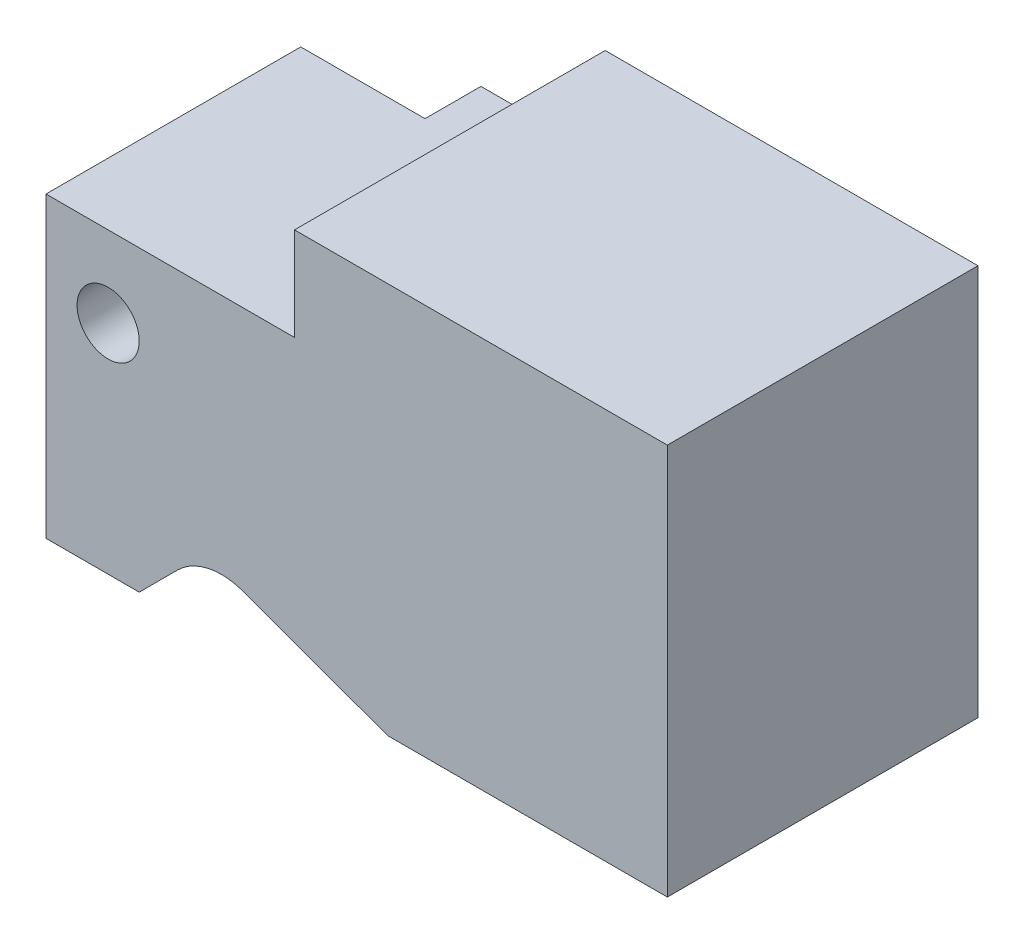
ISO-10303-21;
HEADER;
FILE_DESCRIPTION(('STEP AP214'),'2;1');
FILE_NAME('part.step','',(''),(''),'','','');
FILE_SCHEMA(('AUTOMOTIVE_DESIGN { 1 0 10303 214 1 1 1 1 }'));
ENDSEC;
DATA;
#1=APPLICATION_CONTEXT('core data for automotive mechanical design processes');
#2=APPLICATION_PROTOCOL_DEFINITION('international standard','automotive_design',2000,#1);
#3=PRODUCT_CONTEXT('',#1,'mechanical');
#4=PRODUCT('Part','Part','',(#3));
#5=PRODUCT_RELATED_PRODUCT_CATEGORY('part','',(#4));
#6=PRODUCT_DEFINITION_FORMATION('','',#4);
#7=PRODUCT_DEFINITION_CONTEXT('part definition',#1,'design');
#8=PRODUCT_DEFINITION('design','',#6,#7);
#9=PRODUCT_DEFINITION_SHAPE('','',#8);
#10=(LENGTH_UNIT() NAMED_UNIT(*) SI_UNIT(.MILLI.,.METRE.));
#11=(NAMED_UNIT(*) PLANE_ANGLE_UNIT() SI_UNIT($,.RADIAN.));
#12=(NAMED_UNIT(*) SI_UNIT($,.STERADIAN.) SOLID_ANGLE_UNIT());
#13=UNCERTAINTY_MEASURE_WITH_UNIT(LENGTH_MEASURE(1.E-05),#10,'distance_accuracy_value','');
#14=(GEOMETRIC_REPRESENTATION_CONTEXT(3) GLOBAL_UNCERTAINTY_ASSIGNED_CONTEXT((#13)) GLOBAL_UNIT_ASSIGNED_CONTEXT((#10,
#11,#12)) REPRESENTATION_CONTEXT('',''));
#15=CARTESIAN_POINT('',(0.,0.,0.));
#16=DIRECTION('',(0.,0.,1.));
#17=DIRECTION('',(1.,0.,0.));
#18=AXIS2_PLACEMENT_3D('',#15,#16,#17);
#19=CARTESIAN_POINT('',(70.,35.,-5.));
#20=DIRECTION('',(0.,0.,1.));
#21=DIRECTION('',(1.,0.,0.));
#22=AXIS2_PLACEMENT_3D('',#19,#20,#21);
#23=CYLINDRICAL_SURFACE('',#22,10.);
#24=CARTESIAN_POINT('',(70.,35.,0.));
#25=DIRECTION('',(0.,0.,-1.));
#26=DIRECTION('',(-1.,0.,0.));
#27=AXIS2_PLACEMENT_3D('',#24,#25,#26);
#28=CIRCLE('',#27,10.);
#29=CARTESIAN_POINT('',(70.,45.,0.));
#30=VERTEX_POINT('',#29);
#31=CARTESIAN_POINT('',(70.,25.,0.));
#32=VERTEX_POINT('',#31);
#33=EDGE_CURVE('E86',#30,#32,#28,.F.);
#34=ORIENTED_EDGE('',*,*,#33,.F.);
#35=DIRECTION('',(0.,0.,1.));
#36=VECTOR('',#35,1.);
#37=CARTESIAN_POINT('',(70.,45.,-5.));
#38=LINE('',#37,#36);
#39=CARTESIAN_POINT('',(70.,45.,-5.));
#40=VERTEX_POINT('',#39);
#41=EDGE_CURVE('E12',#40,#30,#38,.T.);
#42=ORIENTED_EDGE('',*,*,#41,.F.);
#43=CARTESIAN_POINT('',(70.,35.,-5.));
#44=DIRECTION('',(0.,0.,-1.));
#45=DIRECTION('',(-1.,0.,0.));
#46=AXIS2_PLACEMENT_3D('',#43,#44,#45);
#47=CIRCLE('',#46,10.);
#48=CARTESIAN_POINT('',(70.,25.,-5.));
#49=VERTEX_POINT('',#48);
#50=EDGE_CURVE('E87',#40,#49,#47,.F.);
#51=ORIENTED_EDGE('',*,*,#50,.T.);
#52=DIRECTION('',(0.,0.,1.));
#53=VECTOR('',#52,1.);
#54=CARTESIAN_POINT('',(70.,25.,-5.));
#55=LINE('',#54,#53);
#56=EDGE_CURVE('E83',#49,#32,#55,.T.);
#57=ORIENTED_EDGE('',*,*,#56,.T.);
#58=EDGE_LOOP('',(#34,#42,#51,#57));
#59=FACE_BOUND('',#58,.T.);
#60=ADVANCED_FACE('F47',(#59),#23,.T.);
#61=CARTESIAN_POINT('',(70.,0.,-5.));
#62=DIRECTION('',(-1.,0.,0.));
#63=DIRECTION('',(0.,0.,1.));
#64=AXIS2_PLACEMENT_3D('',#61,#62,#63);
#65=PLANE('',#64);
#66=DIRECTION('',(0.,-1.,0.));
#67=VECTOR('',#66,1.);
#68=CARTESIAN_POINT('',(70.,0.,0.));
#69=LINE('',#68,#67);
#70=CARTESIAN_POINT('',(70.,40.,0.));
#71=VERTEX_POINT('',#70);
#72=EDGE_CURVE('E96',#30,#71,#69,.T.);
#73=ORIENTED_EDGE('',*,*,#72,.T.);
#74=DIRECTION('',(0.,0.,1.));
#75=VECTOR('',#74,1.);
#76=CARTESIAN_POINT('',(70.,40.,-5.));
#77=LINE('',#76,#75);
#78=CARTESIAN_POINT('',(70.,40.,-5.));
#79=VERTEX_POINT('',#78);
#80=EDGE_CURVE('E55',#79,#71,#77,.T.);
#81=ORIENTED_EDGE('',*,*,#80,.F.);
#82=DIRECTION('',(0.,-1.,0.));
#83=VECTOR('',#82,1.);
#84=CARTESIAN_POINT('',(70.,0.,-5.));
#85=LINE('',#84,#83);
#86=EDGE_CURVE('E118',#40,#79,#85,.T.);
#87=ORIENTED_EDGE('',*,*,#86,.F.);
#88=ORIENTED_EDGE('',*,*,#41,.T.);
#89=EDGE_LOOP('',(#73,#81,#87,#88));
#90=FACE_BOUND('',#89,.T.);
#91=ADVANCED_FACE('F117',(#90),#65,.F.);
#92=CARTESIAN_POINT('',(70.,0.,-5.));
#93=DIRECTION('',(-1.,0.,0.));
#94=DIRECTION('',(0.,0.,1.));
#95=AXIS2_PLACEMENT_3D('',#92,#93,#94);
#96=PLANE('',#95);
#97=DIRECTION('',(0.,-1.,0.));
#98=VECTOR('',#97,1.);
#99=CARTESIAN_POINT('',(70.,0.,0.));
#100=LINE('',#99,#98);
#101=CARTESIAN_POINT('',(70.,30.,0.));
#102=VERTEX_POINT('',#101);
#103=EDGE_CURVE('E92',#102,#32,#100,.T.);
#104=ORIENTED_EDGE('',*,*,#103,.T.);
#105=ORIENTED_EDGE('',*,*,#56,.F.);
#106=DIRECTION('',(0.,-1.,0.));
#107=VECTOR('',#106,1.);
#108=CARTESIAN_POINT('',(70.,0.,-5.));
#109=LINE('',#108,#107);
#110=CARTESIAN_POINT('',(70.,30.,-5.));
#111=VERTEX_POINT('',#110);
#112=EDGE_CURVE('E63',#111,#49,#109,.T.);
#113=ORIENTED_EDGE('',*,*,#112,.F.);
#114=DIRECTION('',(0.,0.,1.));
#115=VECTOR('',#114,1.);
#116=CARTESIAN_POINT('',(70.,30.,-5.));
#117=LINE('',#116,#115);
#118=EDGE_CURVE('E89',#111,#102,#117,.T.);
#119=ORIENTED_EDGE('',*,*,#118,.T.);
#120=EDGE_LOOP('',(#104,#105,#113,#119));
#121=FACE_BOUND('',#120,.T.);
#122=ADVANCED_FACE('F93',(#121),#96,.F.);
#123=CARTESIAN_POINT('',(0.,0.,-5.));
#124=DIRECTION('',(0.,0.,-1.));
#125=DIRECTION('',(-1.,0.,0.));
#126=AXIS2_PLACEMENT_3D('',#123,#124,#125);
#127=PLANE('',#126);
#128=ORIENTED_EDGE('',*,*,#50,.F.);
#129=ORIENTED_EDGE('',*,*,#86,.T.);
#130=CARTESIAN_POINT('',(70.,35.,-5.));
#131=DIRECTION('',(0.,0.,-1.));
#132=DIRECTION('',(-1.,0.,0.));
#133=AXIS2_PLACEMENT_3D('',#130,#131,#132);
#134=CIRCLE('',#133,5.00000000000001);
#135=EDGE_CURVE('E113',#111,#79,#134,.T.);
#136=ORIENTED_EDGE('',*,*,#135,.F.);
#137=ORIENTED_EDGE('',*,*,#112,.T.);
#138=EDGE_LOOP('',(#128,#129,#136,#137));
#139=FACE_BOUND('',#138,.T.);
#140=ADVANCED_FACE('F120',(#139),#127,.T.);
#141=CARTESIAN_POINT('',(0.,0.,0.));
#142=DIRECTION('',(0.,0.,-1.));
#143=DIRECTION('',(-1.,0.,0.));
#144=AXIS2_PLACEMENT_3D('',#141,#142,#143);
#145=PLANE('',#144);
#146=ORIENTED_EDGE('',*,*,#33,.T.);
#147=ORIENTED_EDGE('',*,*,#103,.F.);
#148=CARTESIAN_POINT('',(70.,35.,0.));
#149=DIRECTION('',(0.,0.,-1.));
#150=DIRECTION('',(-1.,0.,0.));
#151=AXIS2_PLACEMENT_3D('',#148,#149,#150);
#152=CIRCLE('',#151,5.00000000000001);
#153=EDGE_CURVE('E77',#71,#102,#152,.T.);
#154=ORIENTED_EDGE('',*,*,#153,.F.);
#155=ORIENTED_EDGE('',*,*,#72,.F.);
#156=EDGE_LOOP('',(#146,#147,#154,#155));
#157=FACE_BOUND('',#156,.T.);
#158=ADVANCED_FACE('F98',(#157),#145,.F.);
#159=CARTESIAN_POINT('',(70.,35.,-8.));
#160=DIRECTION('',(0.,0.,1.));
#161=DIRECTION('',(1.,0.,0.));
#162=AXIS2_PLACEMENT_3D('',#159,#160,#161);
#163=CYLINDRICAL_SURFACE('',#162,5.00000000000001);
#164=CARTESIAN_POINT('',(70.,35.,-8.));
#165=DIRECTION('',(0.,0.,-1.));
#166=DIRECTION('',(-1.,0.,0.));
#167=AXIS2_PLACEMENT_3D('',#164,#165,#166);
#168=CIRCLE('',#167,5.00000000000001);
#169=CARTESIAN_POINT('',(65.,35.,-8.));
#170=VERTEX_POINT('',#169);
#171=EDGE_CURVE('E100',#170,#170,#168,.T.);
#172=ORIENTED_EDGE('',*,*,#171,.F.);
#173=EDGE_LOOP('',(#172));
#174=FACE_BOUND('',#173,.T.);
#175=ORIENTED_EDGE('',*,*,#135,.T.);
#176=ORIENTED_EDGE('',*,*,#80,.T.);
#177=ORIENTED_EDGE('',*,*,#153,.T.);
#178=ORIENTED_EDGE('',*,*,#118,.F.);
#179=EDGE_LOOP('',(#175,#176,#177,#178));
#180=FACE_BOUND('',#179,.T.);
#181=ADVANCED_FACE('F111',(#174,#180),#163,.T.);
#182=CARTESIAN_POINT('',(0.,0.,-8.));
#183=DIRECTION('',(0.,0.,-1.));
#184=DIRECTION('',(-1.,0.,0.));
#185=AXIS2_PLACEMENT_3D('',#182,#183,#184);
#186=PLANE('',#185);
#187=ORIENTED_EDGE('',*,*,#171,.T.);
#188=EDGE_LOOP('',(#187));
#189=FACE_BOUND('',#188,.T.);
#190=ADVANCED_FACE('F162',(#189),#186,.T.);
#191=CLOSED_SHELL('',(#60,#91,#122,#140,#158,#181,#190));
#192=MANIFOLD_SOLID_BREP('B2',#191);
#193=CARTESIAN_POINT('',(0.,0.,50.));
#194=DIRECTION('',(0.,1.,0.));
#195=DIRECTION('',(0.,0.,1.));
#196=AXIS2_PLACEMENT_3D('',#193,#194,#195);
#197=PLANE('',#196);
#198=DIRECTION('',(1.,0.,0.));
#199=VECTOR('',#198,1.);
#200=CARTESIAN_POINT('',(0.,0.,50.));
#201=LINE('',#200,#199);
#202=CARTESIAN_POINT('',(55.,0.,50.));
#203=VERTEX_POINT('',#202);
#204=CARTESIAN_POINT('',(100.,0.,50.));
#205=VERTEX_POINT('',#204);
#206=EDGE_CURVE('E311',#203,#205,#201,.T.);
#207=ORIENTED_EDGE('',*,*,#206,.F.);
#208=DIRECTION('',(0.,0.,-1.));
#209=VECTOR('',#208,1.);
#210=CARTESIAN_POINT('',(55.,0.,50.));
#211=LINE('',#210,#209);
#212=CARTESIAN_POINT('',(55.,0.,0.));
#213=VERTEX_POINT('',#212);
#214=EDGE_CURVE('E361',#203,#213,#211,.T.);
#215=ORIENTED_EDGE('',*,*,#214,.T.);
#216=DIRECTION('',(1.,0.,0.));
#217=VECTOR('',#216,1.);
#218=CARTESIAN_POINT('',(0.,0.,0.));
#219=LINE('',#218,#217);
#220=CARTESIAN_POINT('',(100.,0.,0.));
#221=VERTEX_POINT('',#220);
#222=EDGE_CURVE('E323',#213,#221,#219,.T.);
#223=ORIENTED_EDGE('',*,*,#222,.T.);
#224=DIRECTION('',(0.,0.,-1.));
#225=VECTOR('',#224,1.);
#226=CARTESIAN_POINT('',(100.,0.,50.));
#227=LINE('',#226,#225);
#228=EDGE_CURVE('E197',#205,#221,#227,.T.);
#229=ORIENTED_EDGE('',*,*,#228,.F.);
#230=EDGE_LOOP('',(#207,#215,#223,#229));
#231=FACE_BOUND('',#230,.T.);
#232=ADVANCED_FACE('F188',(#231),#197,.F.);
#233=CARTESIAN_POINT('',(0.,0.,50.));
#234=DIRECTION('',(1.,0.,0.));
#235=DIRECTION('',(0.,0.,-1.));
#236=AXIS2_PLACEMENT_3D('',#233,#234,#235);
#237=PLANE('',#236);
#238=DIRECTION('',(0.,0.,-1.));
#239=VECTOR('',#238,1.);
#240=CARTESIAN_POINT('',(0.,15.,9.));
#241=LINE('',#240,#239);
#242=CARTESIAN_POINT('',(0.,15.,9.));
#243=VERTEX_POINT('',#242);
#244=CARTESIAN_POINT('',(0.,15.,0.));
#245=VERTEX_POINT('',#244);
#246=EDGE_CURVE('E382',#243,#245,#241,.T.);
#247=ORIENTED_EDGE('',*,*,#246,.T.);
#248=DIRECTION('',(0.,-1.,0.));
#249=VECTOR('',#248,1.);
#250=CARTESIAN_POINT('',(0.,0.,0.));
#251=LINE('',#250,#249);
#252=CARTESIAN_POINT('',(0.,0.,0.));
#253=VERTEX_POINT('',#252);
#254=EDGE_CURVE('E321',#245,#253,#251,.T.);
#255=ORIENTED_EDGE('',*,*,#254,.T.);
#256=DIRECTION('',(0.,0.,-1.));
#257=VECTOR('',#256,1.);
#258=CARTESIAN_POINT('',(0.,0.,50.));
#259=LINE('',#258,#257);
#260=CARTESIAN_POINT('',(0.,0.,50.));
#261=VERTEX_POINT('',#260);
#262=EDGE_CURVE('E45',#261,#253,#259,.T.);
#263=ORIENTED_EDGE('',*,*,#262,.F.);
#264=DIRECTION('',(0.,-1.,0.));
#265=VECTOR('',#264,1.);
#266=CARTESIAN_POINT('',(0.,0.,50.));
#267=LINE('',#266,#265);
#268=CARTESIAN_POINT('',(0.,48.,50.));
#269=VERTEX_POINT('',#268);
#270=EDGE_CURVE('E309',#269,#261,#267,.T.);
#271=ORIENTED_EDGE('',*,*,#270,.F.);
#272=DIRECTION('',(0.,0.,-1.));
#273=VECTOR('',#272,1.);
#274=CARTESIAN_POINT('',(0.,48.,50.));
#275=LINE('',#274,#273);
#276=CARTESIAN_POINT('',(0.,48.,9.));
#277=VERTEX_POINT('',#276);
#278=EDGE_CURVE('E324',#269,#277,#275,.T.);
#279=ORIENTED_EDGE('',*,*,#278,.T.);
#280=DIRECTION('',(0.,1.,0.));
#281=VECTOR('',#280,1.);
#282=CARTESIAN_POINT('',(0.,0.,9.));
#283=LINE('',#282,#281);
#284=EDGE_CURVE('E212',#243,#277,#283,.T.);
#285=ORIENTED_EDGE('',*,*,#284,.F.);
#286=EDGE_LOOP('',(#247,#255,#263,#271,#279,#285));
#287=FACE_BOUND('',#286,.T.);
#288=ADVANCED_FACE('F190',(#287),#237,.F.);
#289=CARTESIAN_POINT('',(0.,0.,0.));
#290=DIRECTION('',(0.,0.,-1.));
#291=DIRECTION('',(-1.,0.,0.));
#292=AXIS2_PLACEMENT_3D('',#289,#290,#291);
#293=PLANE('',#292);
#294=CARTESIAN_POINT('',(70.,35.,0.));
#295=DIRECTION('',(0.,0.,-1.));
#296=DIRECTION('',(-1.,0.,0.));
#297=AXIS2_PLACEMENT_3D('',#294,#295,#296);
#298=CIRCLE('',#297,25.);
#299=CARTESIAN_POINT('',(45.,35.,0.));
#300=VERTEX_POINT('',#299);
#301=EDGE_CURVE('E420',#300,#300,#298,.T.);
#302=ORIENTED_EDGE('',*,*,#301,.F.);
#303=EDGE_LOOP('',(#302));
#304=FACE_BOUND('',#303,.T.);
#305=DIRECTION('',(0.939692620785908,-0.342020143325669,0.));
#306=VECTOR('',#305,1.);
#307=CARTESIAN_POINT('',(31.6603490669296,8.49493821780105,0.));
#308=LINE('',#307,#306);
#309=CARTESIAN_POINT('',(31.6603490669296,8.49493821780104,0.));
#310=VERTEX_POINT('',#309);
#311=EDGE_CURVE('E294',#310,#213,#308,.T.);
#312=ORIENTED_EDGE('',*,*,#311,.F.);
#313=CARTESIAN_POINT('',(28.2401476336729,-0.901987990058035,0.));
#314=DIRECTION('',(0.,0.,-1.));
#315=DIRECTION('',(-1.,0.,0.));
#316=AXIS2_PLACEMENT_3D('',#313,#314,#315);
#317=CIRCLE('',#316,10.);
#318=CARTESIAN_POINT('',(21.1690798218074,6.16907982180743,0.));
#319=VERTEX_POINT('',#318);
#320=EDGE_CURVE('E416',#319,#310,#317,.T.);
#321=ORIENTED_EDGE('',*,*,#320,.F.);
#322=DIRECTION('',(0.707106781186547,0.707106781186548,0.));
#323=VECTOR('',#322,1.);
#324=CARTESIAN_POINT('',(15.,0.,0.));
#325=LINE('',#324,#323);
#326=CARTESIAN_POINT('',(15.,0.,0.));
#327=VERTEX_POINT('',#326);
#328=EDGE_CURVE('E414',#327,#319,#325,.T.);
#329=ORIENTED_EDGE('',*,*,#328,.F.);
#330=EDGE_CURVE('E303',#253,#327,#219,.T.);
#331=ORIENTED_EDGE('',*,*,#330,.F.);
#332=ORIENTED_EDGE('',*,*,#254,.F.);
#333=CARTESIAN_POINT('',(0.,35.,0.));
#334=DIRECTION('',(0.,0.,-1.));
#335=DIRECTION('',(-1.,0.,0.));
#336=AXIS2_PLACEMENT_3D('',#333,#334,#335);
#337=CIRCLE('',#336,20.);
#338=CARTESIAN_POINT('',(20.,35.,0.));
#339=VERTEX_POINT('',#338);
#340=EDGE_CURVE('E383',#245,#339,#337,.F.);
#341=ORIENTED_EDGE('',*,*,#340,.T.);
#342=DIRECTION('',(0.,1.,0.));
#343=VECTOR('',#342,1.);
#344=CARTESIAN_POINT('',(20.,0.,0.));
#345=LINE('',#344,#343);
#346=CARTESIAN_POINT('',(20.,48.,0.));
#347=VERTEX_POINT('',#346);
#348=EDGE_CURVE('E376',#339,#347,#345,.T.);
#349=ORIENTED_EDGE('',*,*,#348,.T.);
#350=DIRECTION('',(-1.,0.,0.));
#351=VECTOR('',#350,1.);
#352=CARTESIAN_POINT('',(40.,48.,0.));
#353=LINE('',#352,#351);
#354=CARTESIAN_POINT('',(40.,48.,0.));
#355=VERTEX_POINT('',#354);
#356=EDGE_CURVE('E397',#355,#347,#353,.T.);
#357=ORIENTED_EDGE('',*,*,#356,.F.);
#358=DIRECTION('',(0.,-1.,0.));
#359=VECTOR('',#358,1.);
#360=CARTESIAN_POINT('',(40.,63.,0.));
#361=LINE('',#360,#359);
#362=CARTESIAN_POINT('',(40.,63.,0.));
#363=VERTEX_POINT('',#362);
#364=EDGE_CURVE('E350',#363,#355,#361,.T.);
#365=ORIENTED_EDGE('',*,*,#364,.F.);
#366=DIRECTION('',(-1.,0.,0.));
#367=VECTOR('',#366,1.);
#368=CARTESIAN_POINT('',(0.,63.,0.));
#369=LINE('',#368,#367);
#370=CARTESIAN_POINT('',(100.,63.,0.));
#371=VERTEX_POINT('',#370);
#372=EDGE_CURVE('E328',#371,#363,#369,.T.);
#373=ORIENTED_EDGE('',*,*,#372,.F.);
#374=DIRECTION('',(0.,1.,0.));
#375=VECTOR('',#374,1.);
#376=CARTESIAN_POINT('',(100.,0.,0.));
#377=LINE('',#376,#375);
#378=EDGE_CURVE('E326',#221,#371,#377,.T.);
#379=ORIENTED_EDGE('',*,*,#378,.F.);
#380=ORIENTED_EDGE('',*,*,#222,.F.);
#381=EDGE_LOOP('',(#312,#321,#329,#331,#332,#341,#349,#357,#365,#373,#379,#380));
#382=FACE_BOUND('',#381,.T.);
#383=ADVANCED_FACE('F346',(#304,#382),#293,.T.);
#384=CARTESIAN_POINT('',(40.,48.,50.));
#385=DIRECTION('',(0.,-1.,0.));
#386=DIRECTION('',(0.,0.,-1.));
#387=AXIS2_PLACEMENT_3D('',#384,#385,#386);
#388=PLANE('',#387);
#389=DIRECTION('',(0.,0.,-1.));
#390=VECTOR('',#389,1.);
#391=CARTESIAN_POINT('',(20.,48.,9.));
#392=LINE('',#391,#390);
#393=CARTESIAN_POINT('',(20.,48.,9.));
#394=VERTEX_POINT('',#393);
#395=EDGE_CURVE('E391',#394,#347,#392,.T.);
#396=ORIENTED_EDGE('',*,*,#395,.F.);
#397=DIRECTION('',(1.,0.,0.));
#398=VECTOR('',#397,1.);
#399=CARTESIAN_POINT('',(0.,48.,9.));
#400=LINE('',#399,#398);
#401=EDGE_CURVE('E378',#277,#394,#400,.T.);
#402=ORIENTED_EDGE('',*,*,#401,.F.);
#403=ORIENTED_EDGE('',*,*,#278,.F.);
#404=DIRECTION('',(-1.,0.,0.));
#405=VECTOR('',#404,1.);
#406=CARTESIAN_POINT('',(40.,48.,50.));
#407=LINE('',#406,#405);
#408=CARTESIAN_POINT('',(40.,48.,50.));
#409=VERTEX_POINT('',#408);
#410=EDGE_CURVE('E396',#409,#269,#407,.T.);
#411=ORIENTED_EDGE('',*,*,#410,.F.);
#412=DIRECTION('',(0.,0.,-1.));
#413=VECTOR('',#412,1.);
#414=CARTESIAN_POINT('',(40.,48.,50.));
#415=LINE('',#414,#413);
#416=EDGE_CURVE('E404',#409,#355,#415,.T.);
#417=ORIENTED_EDGE('',*,*,#416,.T.);
#418=ORIENTED_EDGE('',*,*,#356,.T.);
#419=EDGE_LOOP('',(#396,#402,#403,#411,#417,#418));
#420=FACE_BOUND('',#419,.T.);
#421=ADVANCED_FACE('F410',(#420),#388,.F.);
#422=ORIENTED_EDGE('',*,*,#330,.T.);
#423=DIRECTION('',(0.,0.,-1.));
#424=VECTOR('',#423,1.);
#425=CARTESIAN_POINT('',(15.,0.,50.));
#426=LINE('',#425,#424);
#427=CARTESIAN_POINT('',(15.,0.,50.));
#428=VERTEX_POINT('',#427);
#429=EDGE_CURVE('E289',#428,#327,#426,.T.);
#430=ORIENTED_EDGE('',*,*,#429,.F.);
#431=EDGE_CURVE('E300',#261,#428,#201,.T.);
#432=ORIENTED_EDGE('',*,*,#431,.F.);
#433=ORIENTED_EDGE('',*,*,#262,.T.);
#434=EDGE_LOOP('',(#422,#430,#432,#433));
#435=FACE_BOUND('',#434,.T.);
#436=ADVANCED_FACE('F299',(#435),#197,.F.);
#437=CARTESIAN_POINT('',(100.,0.,50.));
#438=DIRECTION('',(-1.,0.,0.));
#439=DIRECTION('',(0.,0.,1.));
#440=AXIS2_PLACEMENT_3D('',#437,#438,#439);
#441=PLANE('',#440);
#442=ORIENTED_EDGE('',*,*,#378,.T.);
#443=DIRECTION('',(0.,0.,-1.));
#444=VECTOR('',#443,1.);
#445=CARTESIAN_POINT('',(100.,63.,50.));
#446=LINE('',#445,#444);
#447=CARTESIAN_POINT('',(100.,63.,50.));
#448=VERTEX_POINT('',#447);
#449=EDGE_CURVE('E320',#448,#371,#446,.T.);
#450=ORIENTED_EDGE('',*,*,#449,.F.);
#451=DIRECTION('',(0.,1.,0.));
#452=VECTOR('',#451,1.);
#453=CARTESIAN_POINT('',(100.,0.,50.));
#454=LINE('',#453,#452);
#455=EDGE_CURVE('E310',#205,#448,#454,.T.);
#456=ORIENTED_EDGE('',*,*,#455,.F.);
#457=ORIENTED_EDGE('',*,*,#228,.T.);
#458=EDGE_LOOP('',(#442,#450,#456,#457));
#459=FACE_BOUND('',#458,.T.);
#460=ADVANCED_FACE('F338',(#459),#441,.F.);
#461=CARTESIAN_POINT('',(0.,63.,50.));
#462=DIRECTION('',(0.,-1.,0.));
#463=DIRECTION('',(0.,0.,-1.));
#464=AXIS2_PLACEMENT_3D('',#461,#462,#463);
#465=PLANE('',#464);
#466=ORIENTED_EDGE('',*,*,#372,.T.);
#467=DIRECTION('',(0.,0.,-1.));
#468=VECTOR('',#467,1.);
#469=CARTESIAN_POINT('',(40.,63.,50.));
#470=LINE('',#469,#468);
#471=CARTESIAN_POINT('',(40.,63.,50.));
#472=VERTEX_POINT('',#471);
#473=EDGE_CURVE('E355',#472,#363,#470,.T.);
#474=ORIENTED_EDGE('',*,*,#473,.F.);
#475=DIRECTION('',(-1.,0.,0.));
#476=VECTOR('',#475,1.);
#477=CARTESIAN_POINT('',(0.,63.,50.));
#478=LINE('',#477,#476);
#479=EDGE_CURVE('E313',#448,#472,#478,.T.);
#480=ORIENTED_EDGE('',*,*,#479,.F.);
#481=ORIENTED_EDGE('',*,*,#449,.T.);
#482=EDGE_LOOP('',(#466,#474,#480,#481));
#483=FACE_BOUND('',#482,.T.);
#484=ADVANCED_FACE('F353',(#483),#465,.F.);
#485=CARTESIAN_POINT('',(0.,0.,50.));
#486=DIRECTION('',(0.,0.,-1.));
#487=DIRECTION('',(-1.,0.,0.));
#488=AXIS2_PLACEMENT_3D('',#485,#486,#487);
#489=PLANE('',#488);
#490=CARTESIAN_POINT('',(10.,35.,50.));
#491=DIRECTION('',(0.,0.,-1.));
#492=DIRECTION('',(-1.,0.,0.));
#493=AXIS2_PLACEMENT_3D('',#490,#491,#492);
#494=CIRCLE('',#493,5.);
#495=CARTESIAN_POINT('',(5.,35.,50.));
#496=VERTEX_POINT('',#495);
#497=EDGE_CURVE('E363',#496,#496,#494,.T.);
#498=ORIENTED_EDGE('',*,*,#497,.T.);
#499=EDGE_LOOP('',(#498));
#500=FACE_BOUND('',#499,.T.);
#501=CARTESIAN_POINT('',(28.2401476336729,-0.901987990058035,50.));
#502=DIRECTION('',(0.,0.,-1.));
#503=DIRECTION('',(-1.,0.,0.));
#504=AXIS2_PLACEMENT_3D('',#501,#502,#503);
#505=CIRCLE('',#504,10.);
#506=CARTESIAN_POINT('',(21.1690798218074,6.16907982180743,50.));
#507=VERTEX_POINT('',#506);
#508=CARTESIAN_POINT('',(31.6603490669296,8.49493821780104,50.));
#509=VERTEX_POINT('',#508);
#510=EDGE_CURVE('E204',#507,#509,#505,.T.);
#511=ORIENTED_EDGE('',*,*,#510,.T.);
#512=DIRECTION('',(0.939692620785908,-0.342020143325669,0.));
#513=VECTOR('',#512,1.);
#514=CARTESIAN_POINT('',(31.6603490669296,8.49493821780105,50.));
#515=LINE('',#514,#513);
#516=EDGE_CURVE('E304',#509,#203,#515,.T.);
#517=ORIENTED_EDGE('',*,*,#516,.T.);
#518=ORIENTED_EDGE('',*,*,#206,.T.);
#519=ORIENTED_EDGE('',*,*,#455,.T.);
#520=ORIENTED_EDGE('',*,*,#479,.T.);
#521=DIRECTION('',(0.,-1.,0.));
#522=VECTOR('',#521,1.);
#523=CARTESIAN_POINT('',(40.,63.,50.));
#524=LINE('',#523,#522);
#525=EDGE_CURVE('E357',#472,#409,#524,.T.);
#526=ORIENTED_EDGE('',*,*,#525,.T.);
#527=ORIENTED_EDGE('',*,*,#410,.T.);
#528=ORIENTED_EDGE('',*,*,#270,.T.);
#529=ORIENTED_EDGE('',*,*,#431,.T.);
#530=DIRECTION('',(0.707106781186547,0.707106781186548,0.));
#531=VECTOR('',#530,1.);
#532=CARTESIAN_POINT('',(15.,0.,50.));
#533=LINE('',#532,#531);
#534=EDGE_CURVE('E285',#428,#507,#533,.T.);
#535=ORIENTED_EDGE('',*,*,#534,.T.);
#536=EDGE_LOOP('',(#511,#517,#518,#519,#520,#526,#527,#528,#529,#535));
#537=FACE_BOUND('',#536,.T.);
#538=ADVANCED_FACE('F306',(#500,#537),#489,.F.);
#539=CARTESIAN_POINT('',(40.,63.,50.));
#540=DIRECTION('',(1.,0.,0.));
#541=DIRECTION('',(0.,0.,-1.));
#542=AXIS2_PLACEMENT_3D('',#539,#540,#541);
#543=PLANE('',#542);
#544=ORIENTED_EDGE('',*,*,#364,.T.);
#545=ORIENTED_EDGE('',*,*,#416,.F.);
#546=ORIENTED_EDGE('',*,*,#525,.F.);
#547=ORIENTED_EDGE('',*,*,#473,.T.);
#548=EDGE_LOOP('',(#544,#545,#546,#547));
#549=FACE_BOUND('',#548,.T.);
#550=ADVANCED_FACE('F406',(#549),#543,.F.);
#551=CARTESIAN_POINT('',(0.,35.,9.));
#552=DIRECTION('',(0.,0.,-1.));
#553=DIRECTION('',(-1.,0.,0.));
#554=AXIS2_PLACEMENT_3D('',#551,#552,#553);
#555=CYLINDRICAL_SURFACE('',#554,20.);
#556=ORIENTED_EDGE('',*,*,#340,.F.);
#557=ORIENTED_EDGE('',*,*,#246,.F.);
#558=CARTESIAN_POINT('',(0.,35.,9.));
#559=DIRECTION('',(0.,0.,-1.));
#560=DIRECTION('',(-1.,0.,0.));
#561=AXIS2_PLACEMENT_3D('',#558,#559,#560);
#562=CIRCLE('',#561,20.);
#563=CARTESIAN_POINT('',(20.,35.,9.));
#564=VERTEX_POINT('',#563);
#565=EDGE_CURVE('E373',#243,#564,#562,.F.);
#566=ORIENTED_EDGE('',*,*,#565,.T.);
#567=DIRECTION('',(0.,0.,-1.));
#568=VECTOR('',#567,1.);
#569=CARTESIAN_POINT('',(20.,35.,9.));
#570=LINE('',#569,#568);
#571=EDGE_CURVE('E388',#564,#339,#570,.T.);
#572=ORIENTED_EDGE('',*,*,#571,.T.);
#573=EDGE_LOOP('',(#556,#557,#566,#572));
#574=FACE_BOUND('',#573,.T.);
#575=ADVANCED_FACE('F461',(#574),#555,.F.);
#576=CARTESIAN_POINT('',(20.,0.,9.));
#577=DIRECTION('',(-1.,0.,0.));
#578=DIRECTION('',(0.,0.,1.));
#579=AXIS2_PLACEMENT_3D('',#576,#577,#578);
#580=PLANE('',#579);
#581=ORIENTED_EDGE('',*,*,#348,.F.);
#582=ORIENTED_EDGE('',*,*,#571,.F.);
#583=DIRECTION('',(0.,1.,0.));
#584=VECTOR('',#583,1.);
#585=CARTESIAN_POINT('',(20.,0.,9.));
#586=LINE('',#585,#584);
#587=EDGE_CURVE('E380',#564,#394,#586,.T.);
#588=ORIENTED_EDGE('',*,*,#587,.T.);
#589=ORIENTED_EDGE('',*,*,#395,.T.);
#590=EDGE_LOOP('',(#581,#582,#588,#589));
#591=FACE_BOUND('',#590,.T.);
#592=ADVANCED_FACE('F466',(#591),#580,.T.);
#593=CARTESIAN_POINT('',(0.,0.,9.));
#594=DIRECTION('',(0.,0.,-1.));
#595=DIRECTION('',(-1.,0.,0.));
#596=AXIS2_PLACEMENT_3D('',#593,#594,#595);
#597=PLANE('',#596);
#598=CARTESIAN_POINT('',(10.,35.,9.));
#599=DIRECTION('',(0.,0.,-1.));
#600=DIRECTION('',(-1.,0.,0.));
#601=AXIS2_PLACEMENT_3D('',#598,#599,#600);
#602=CIRCLE('',#601,5.);
#603=CARTESIAN_POINT('',(5.,35.,9.));
#604=VERTEX_POINT('',#603);
#605=EDGE_CURVE('E192',#604,#604,#602,.T.);
#606=ORIENTED_EDGE('',*,*,#605,.F.);
#607=EDGE_LOOP('',(#606));
#608=FACE_BOUND('',#607,.T.);
#609=ORIENTED_EDGE('',*,*,#565,.F.);
#610=ORIENTED_EDGE('',*,*,#284,.T.);
#611=ORIENTED_EDGE('',*,*,#401,.T.);
#612=ORIENTED_EDGE('',*,*,#587,.F.);
#613=EDGE_LOOP('',(#609,#610,#611,#612));
#614=FACE_BOUND('',#613,.T.);
#615=ADVANCED_FACE('F470',(#608,#614),#597,.T.);
#616=CARTESIAN_POINT('',(10.,35.,50.));
#617=DIRECTION('',(0.,0.,-1.));
#618=DIRECTION('',(-1.,0.,0.));
#619=AXIS2_PLACEMENT_3D('',#616,#617,#618);
#620=CYLINDRICAL_SURFACE('',#619,5.);
#621=ORIENTED_EDGE('',*,*,#605,.T.);
#622=EDGE_LOOP('',(#621));
#623=FACE_BOUND('',#622,.T.);
#624=ORIENTED_EDGE('',*,*,#497,.F.);
#625=EDGE_LOOP('',(#624));
#626=FACE_BOUND('',#625,.T.);
#627=ADVANCED_FACE('F474',(#623,#626),#620,.F.);
#628=CARTESIAN_POINT('',(31.6603490669296,8.49493821780105,50.));
#629=DIRECTION('',(0.342020143325669,0.939692620785908,0.));
#630=DIRECTION('',(-0.939692620785908,0.342020143325669,0.));
#631=AXIS2_PLACEMENT_3D('',#628,#629,#630);
#632=PLANE('',#631);
#633=ORIENTED_EDGE('',*,*,#311,.T.);
#634=ORIENTED_EDGE('',*,*,#214,.F.);
#635=ORIENTED_EDGE('',*,*,#516,.F.);
#636=DIRECTION('',(0.,0.,-1.));
#637=VECTOR('',#636,1.);
#638=CARTESIAN_POINT('',(31.6603490669296,8.49493821780104,50.));
#639=LINE('',#638,#637);
#640=EDGE_CURVE('E364',#509,#310,#639,.T.);
#641=ORIENTED_EDGE('',*,*,#640,.T.);
#642=EDGE_LOOP('',(#633,#634,#635,#641));
#643=FACE_BOUND('',#642,.T.);
#644=ADVANCED_FACE('F478',(#643),#632,.F.);
#645=CARTESIAN_POINT('',(28.2401476336729,-0.901987990058035,50.));
#646=DIRECTION('',(0.,0.,-1.));
#647=DIRECTION('',(-1.,0.,0.));
#648=AXIS2_PLACEMENT_3D('',#645,#646,#647);
#649=CYLINDRICAL_SURFACE('',#648,10.);
#650=ORIENTED_EDGE('',*,*,#320,.T.);
#651=ORIENTED_EDGE('',*,*,#640,.F.);
#652=ORIENTED_EDGE('',*,*,#510,.F.);
#653=DIRECTION('',(0.,0.,-1.));
#654=VECTOR('',#653,1.);
#655=CARTESIAN_POINT('',(21.1690798218074,6.16907982180743,50.));
#656=LINE('',#655,#654);
#657=EDGE_CURVE('E291',#507,#319,#656,.T.);
#658=ORIENTED_EDGE('',*,*,#657,.T.);
#659=EDGE_LOOP('',(#650,#651,#652,#658));
#660=FACE_BOUND('',#659,.T.);
#661=ADVANCED_FACE('F482',(#660),#649,.F.);
#662=CARTESIAN_POINT('',(15.,0.,50.));
#663=DIRECTION('',(-0.707106781186548,0.707106781186547,0.));
#664=DIRECTION('',(-0.707106781186547,-0.707106781186548,0.));
#665=AXIS2_PLACEMENT_3D('',#662,#663,#664);
#666=PLANE('',#665);
#667=ORIENTED_EDGE('',*,*,#328,.T.);
#668=ORIENTED_EDGE('',*,*,#657,.F.);
#669=ORIENTED_EDGE('',*,*,#534,.F.);
#670=ORIENTED_EDGE('',*,*,#429,.T.);
#671=EDGE_LOOP('',(#667,#668,#669,#670));
#672=FACE_BOUND('',#671,.T.);
#673=ADVANCED_FACE('F288',(#672),#666,.F.);
#674=CARTESIAN_POINT('',(70.,35.,13.));
#675=DIRECTION('',(0.,0.,-1.));
#676=DIRECTION('',(-1.,0.,0.));
#677=AXIS2_PLACEMENT_3D('',#674,#675,#676);
#678=CYLINDRICAL_SURFACE('',#677,25.);
#679=CARTESIAN_POINT('',(70.,35.,13.));
#680=DIRECTION('',(0.,0.,-1.));
#681=DIRECTION('',(-1.,0.,0.));
#682=AXIS2_PLACEMENT_3D('',#679,#680,#681);
#683=CIRCLE('',#682,25.);
#684=CARTESIAN_POINT('',(45.,35.,13.));
#685=VERTEX_POINT('',#684);
#686=EDGE_CURVE('E417',#685,#685,#683,.T.);
#687=CARTESIAN_POINT('',(45.,35.,13.));
#688=CARTESIAN_POINT('',(45.,35.,12.8645833333333));
#689=CARTESIAN_POINT('',(45.,35.,12.7291666666667));
#690=CARTESIAN_POINT('',(45.,35.,12.4583333333333));
#691=CARTESIAN_POINT('',(45.,35.,12.3229166666667));
#692=CARTESIAN_POINT('',(45.,35.,12.0520833333333));
#693=CARTESIAN_POINT('',(45.,35.,11.9166666666667));
#694=CARTESIAN_POINT('',(45.,35.,11.6458333333333));
#695=CARTESIAN_POINT('',(45.,35.,11.5104166666667));
#696=CARTESIAN_POINT('',(45.,35.,11.2395833333333));
#697=CARTESIAN_POINT('',(45.,35.,11.1041666666667));
#698=CARTESIAN_POINT('',(45.,35.,10.8333333333333));
#699=CARTESIAN_POINT('',(45.,35.,10.6979166666667));
#700=CARTESIAN_POINT('',(45.,35.,10.4270833333333));
#701=CARTESIAN_POINT('',(45.,35.,10.2916666666667));
#702=CARTESIAN_POINT('',(45.,35.,10.0208333333333));
#703=CARTESIAN_POINT('',(45.,35.,9.88541666666667));
#704=CARTESIAN_POINT('',(45.,35.,9.61458333333333));
#705=CARTESIAN_POINT('',(45.,35.,9.47916666666667));
#706=CARTESIAN_POINT('',(45.,35.,9.20833333333333));
#707=CARTESIAN_POINT('',(45.,35.,9.07291666666667));
#708=CARTESIAN_POINT('',(45.,35.,8.80208333333333));
#709=CARTESIAN_POINT('',(45.,35.,8.66666666666667));
#710=CARTESIAN_POINT('',(45.,35.,8.39583333333333));
#711=CARTESIAN_POINT('',(45.,35.,8.26041666666667));
#712=CARTESIAN_POINT('',(45.,35.,7.98958333333333));
#713=CARTESIAN_POINT('',(45.,35.,7.85416666666667));
#714=CARTESIAN_POINT('',(45.,35.,7.58333333333333));
#715=CARTESIAN_POINT('',(45.,35.,7.44791666666667));
#716=CARTESIAN_POINT('',(45.,35.,7.17708333333333));
#717=CARTESIAN_POINT('',(45.,35.,7.04166666666667));
#718=CARTESIAN_POINT('',(45.,35.,6.77083333333333));
#719=CARTESIAN_POINT('',(45.,35.,6.63541666666667));
#720=CARTESIAN_POINT('',(45.,35.,6.36458333333333));
#721=CARTESIAN_POINT('',(45.,35.,6.22916666666667));
#722=CARTESIAN_POINT('',(45.,35.,5.95833333333333));
#723=CARTESIAN_POINT('',(45.,35.,5.82291666666667));
#724=CARTESIAN_POINT('',(45.,35.,5.55208333333333));
#725=CARTESIAN_POINT('',(45.,35.,5.41666666666667));
#726=CARTESIAN_POINT('',(45.,35.,5.14583333333333));
#727=CARTESIAN_POINT('',(45.,35.,5.01041666666667));
#728=CARTESIAN_POINT('',(45.,35.,4.73958333333333));
#729=CARTESIAN_POINT('',(45.,35.,4.60416666666667));
#730=CARTESIAN_POINT('',(45.,35.,4.33333333333333));
#731=CARTESIAN_POINT('',(45.,35.,4.19791666666667));
#732=CARTESIAN_POINT('',(45.,35.,3.92708333333333));
#733=CARTESIAN_POINT('',(45.,35.,3.79166666666667));
#734=CARTESIAN_POINT('',(45.,35.,3.52083333333333));
#735=CARTESIAN_POINT('',(45.,35.,3.38541666666667));
#736=CARTESIAN_POINT('',(45.,35.,3.11458333333333));
#737=CARTESIAN_POINT('',(45.,35.,2.97916666666667));
#738=CARTESIAN_POINT('',(45.,35.,2.70833333333333));
#739=CARTESIAN_POINT('',(45.,35.,2.57291666666667));
#740=CARTESIAN_POINT('',(45.,35.,2.30208333333333));
#741=CARTESIAN_POINT('',(45.,35.,2.16666666666667));
#742=CARTESIAN_POINT('',(45.,35.,1.89583333333333));
#743=CARTESIAN_POINT('',(45.,35.,1.76041666666667));
#744=CARTESIAN_POINT('',(45.,35.,1.48958333333333));
#745=CARTESIAN_POINT('',(45.,35.,1.35416666666667));
#746=CARTESIAN_POINT('',(45.,35.,1.08333333333333));
#747=CARTESIAN_POINT('',(45.,35.,0.947916666666667));
#748=CARTESIAN_POINT('',(45.,35.,0.677083333333334));
#749=CARTESIAN_POINT('',(45.,35.,0.541666666666667));
#750=CARTESIAN_POINT('',(45.,35.,0.270833333333334));
#751=CARTESIAN_POINT('',(45.,35.,0.135416666666667));
#752=CARTESIAN_POINT('',(45.,35.,0.));
#753=B_SPLINE_CURVE_WITH_KNOTS('',3,(#687,#688,#689,#690,#691,#692,#693,#694,#695,#696,#697,
#698,#699,#700,#701,#702,#703,#704,#705,#706,#707,#708,#709,#710,#711,#712,#713,#714,#715,#716,
#717,#718,#719,#720,#721,#722,#723,#724,#725,#726,#727,#728,#729,#730,#731,#732,#733,#734,#735,
#736,#737,#738,#739,#740,#741,#742,#743,#744,#745,#746,#747,#748,#749,#750,#751,#752),
.UNSPECIFIED.,.F.,.F.,(4,2,2,2,2,2,2,2,2,2,2,2,2,2,2,2,2,2,2,2,2,2,2,2,2,2,2,2,2,2,2,2,4),(0.,
0.406249999999999,0.812499999999999,1.21875,1.625,2.03125,2.4375,2.84375,3.25,3.65625,4.0625,
4.46875,4.875,5.28125,5.6875,6.09375,6.5,6.90625,7.3125,7.71875,8.125,8.53125,8.9375,9.34375,
9.75,10.15625,10.5625,10.96875,11.375,11.78125,12.1875,12.59375,13.),.UNSPECIFIED.);
#754=EDGE_CURVE('BSEAM428',#685,#300,#753,.T.);
#755=ORIENTED_EDGE('',*,*,#686,.F.);
#756=ORIENTED_EDGE('',*,*,#301,.T.);
#757=ORIENTED_EDGE('',*,*,#754,.T.);
#758=ORIENTED_EDGE('',*,*,#754,.F.);
#759=EDGE_LOOP('',(#755,#757,#756,#758));
#760=FACE_BOUND('',#759,.T.);
#761=ADVANCED_FACE('F428',(#760),#678,.F.);
#762=CARTESIAN_POINT('',(70.,35.,13.));
#763=DIRECTION('',(0.,0.,-1.));
#764=DIRECTION('',(-1.,0.,0.));
#765=AXIS2_PLACEMENT_3D('',#762,#763,#764);
#766=PLANE('',#765);
#767=ORIENTED_EDGE('',*,*,#686,.T.);
#768=EDGE_LOOP('',(#767));
#769=FACE_BOUND('',#768,.T.);
#770=ADVANCED_FACE('F489',(#769),#766,.T.);
#771=CLOSED_SHELL('',(#232,#288,#383,#421,#436,#460,#484,#538,#550,#575,#592,#615,#627,#644,
#661,#673,#761,#770));
#772=MANIFOLD_SOLID_BREP('B6',#771);
#773=ADVANCED_BREP_SHAPE_REPRESENTATION('',(#18,#192,#772),#14);
#774=SHAPE_DEFINITION_REPRESENTATION(#9,#773);
ENDSEC;
END-ISO-10303-21;
